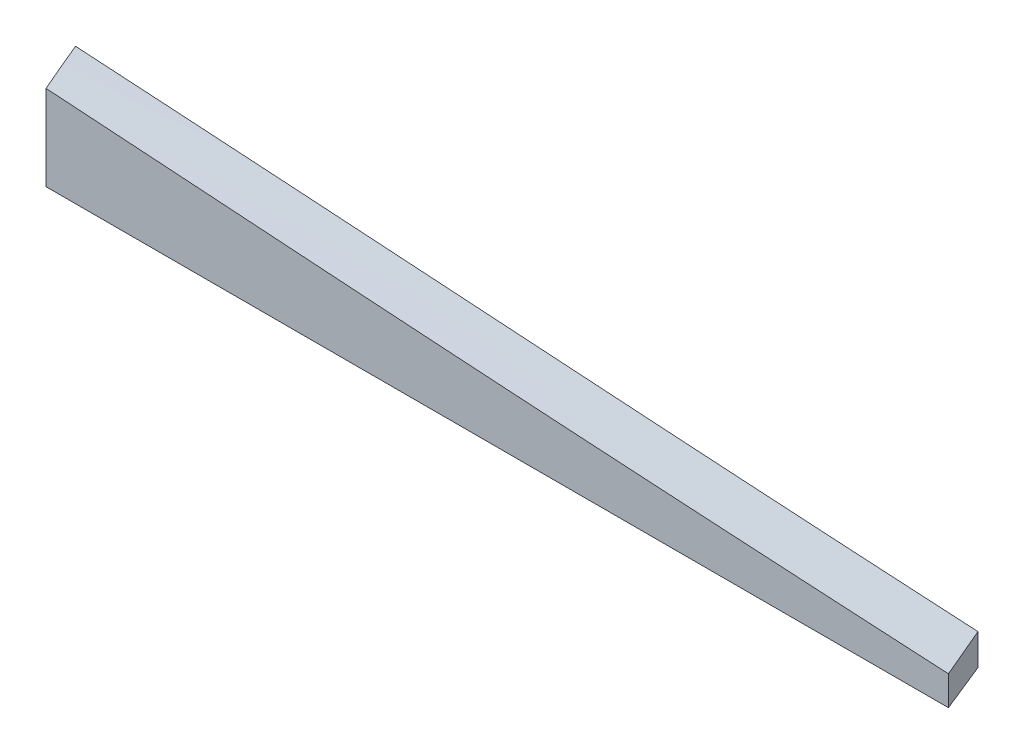
ISO-10303-21;
HEADER;
FILE_DESCRIPTION(('STEP AP214'),'2;1');
FILE_NAME('part.step','',(''),(''),'','','');
FILE_SCHEMA(('AUTOMOTIVE_DESIGN { 1 0 10303 214 1 1 1 1 }'));
ENDSEC;
DATA;
#1=APPLICATION_CONTEXT('core data for automotive mechanical design processes');
#2=APPLICATION_PROTOCOL_DEFINITION('international standard','automotive_design',2000,#1);
#3=PRODUCT_CONTEXT('',#1,'mechanical');
#4=PRODUCT('Part','Part','',(#3));
#5=PRODUCT_RELATED_PRODUCT_CATEGORY('part','',(#4));
#6=PRODUCT_DEFINITION_FORMATION('','',#4);
#7=PRODUCT_DEFINITION_CONTEXT('part definition',#1,'design');
#8=PRODUCT_DEFINITION('design','',#6,#7);
#9=PRODUCT_DEFINITION_SHAPE('','',#8);
#10=(LENGTH_UNIT() NAMED_UNIT(*) SI_UNIT(.MILLI.,.METRE.));
#11=(NAMED_UNIT(*) PLANE_ANGLE_UNIT() SI_UNIT($,.RADIAN.));
#12=(NAMED_UNIT(*) SI_UNIT($,.STERADIAN.) SOLID_ANGLE_UNIT());
#13=UNCERTAINTY_MEASURE_WITH_UNIT(LENGTH_MEASURE(1.E-05),#10,'distance_accuracy_value','');
#14=(GEOMETRIC_REPRESENTATION_CONTEXT(3) GLOBAL_UNCERTAINTY_ASSIGNED_CONTEXT((#13)) GLOBAL_UNIT_ASSIGNED_CONTEXT((#10,
#11,#12)) REPRESENTATION_CONTEXT('',''));
#15=CARTESIAN_POINT('',(0.,0.,0.));
#16=DIRECTION('',(0.,0.,1.));
#17=DIRECTION('',(1.,0.,0.));
#18=AXIS2_PLACEMENT_3D('',#15,#16,#17);
#19=CARTESIAN_POINT('',(176.191855416292,176.191855416292,10.1599999999991));
#20=DIRECTION('',(0.,0.,-1.));
#21=DIRECTION('',(1.,0.,0.));
#22=AXIS2_PLACEMENT_3D('',#19,#20,#21);
#23=PLANE('',#22);
#24=CARTESIAN_POINT('',(176.191855416292,6.02113642863957,10.1599999999991));
#25=CARTESIAN_POINT('',(174.247225110163,6.12565126559782,10.1599999999991));
#26=CARTESIAN_POINT('',(172.302627164037,6.23076641518892,10.1599999999991));
#27=CARTESIAN_POINT('',(168.413490923062,6.44209305818941,10.1599999999991));
#28=CARTESIAN_POINT('',(166.468952628209,6.54830455154917,10.1599999999991));
#29=CARTESIAN_POINT('',(160.635419421535,6.86842713566667,10.1599999999991));
#30=CARTESIAN_POINT('',(156.74650611934,7.08382633413848,10.1599999999991));
#31=CARTESIAN_POINT('',(148.968864720051,7.51825217315289,10.1599999999991));
#32=CARTESIAN_POINT('',(145.080136623869,7.73727882999431,10.1599999999991));
#33=CARTESIAN_POINT('',(137.302889918895,8.17902291198163,10.1599999999991));
#34=CARTESIAN_POINT('',(133.414371310106,8.40174033718502,10.1599999999991));
#35=CARTESIAN_POINT('',(125.637562775753,8.85112386805549,10.1599999999991));
#36=CARTESIAN_POINT('',(121.749272850155,9.07778997311207,10.1599999999991));
#37=CARTESIAN_POINT('',(113.972945937793,9.53542415465873,10.1599999999991));
#38=CARTESIAN_POINT('',(110.084908951034,9.76639223122176,10.1599999999991));
#39=CARTESIAN_POINT('',(102.309133793561,10.2331541702599,10.1599999999991));
#40=CARTESIAN_POINT('',(98.4213956221521,10.4689480211409,10.1599999999991));
#41=CARTESIAN_POINT('',(90.6462464559804,10.945864050744,10.1599999999991));
#42=CARTESIAN_POINT('',(86.7588354611758,11.1869862287767,10.1599999999991));
#43=CARTESIAN_POINT('',(79.0544469405619,11.6704084780646,10.1599999999991));
#44=CARTESIAN_POINT('',(75.2374631667408,11.9126089355652,10.1599999999991));
#45=CARTESIAN_POINT('',(67.6038423962115,12.4024142603291,10.1599999999991));
#46=CARTESIAN_POINT('',(63.7872053995356,12.6500191280943,10.1599999999991));
#47=CARTESIAN_POINT('',(56.1541688068635,13.1489858077573,10.1599999999991));
#48=CARTESIAN_POINT('',(52.3377692114371,13.4003476283461,10.1599999999991));
#49=CARTESIAN_POINT('',(44.7051021546362,13.9050677187285,10.1599999999991));
#50=CARTESIAN_POINT('',(40.8888346932661,14.1584259885886,10.1599999999991));
#51=CARTESIAN_POINT('',(33.256340948859,14.6659804763045,10.1599999999991));
#52=CARTESIAN_POINT('',(29.4401146660344,14.9201766973516,10.1599999999991));
#53=CARTESIAN_POINT('',(21.8076515239075,15.4284102488604,10.1599999999991));
#54=CARTESIAN_POINT('',(17.9914146646052,15.6824475793227,10.1599999999991));
#55=CARTESIAN_POINT('',(10.3588866024945,16.1894698818889,10.159999999999));
#56=CARTESIAN_POINT('',(6.54259539997121,16.4424548582829,10.159999999999));
#57=CARTESIAN_POINT('',(-1.0900850981135,16.9469495597178,10.1599999999991));
#58=CARTESIAN_POINT('',(-4.9064743936905,17.1984592845236,10.1599999999991));
#59=CARTESIAN_POINT('',(-8.72292621578063,17.4490193750531,10.1599999999991));
#60=B_SPLINE_CURVE_WITH_KNOTS('',3,(#24,#25,#26,#27,#28,#29,#30,#31,#32,#33,#34,#35,#36,#37,#38,
#39,#40,#41,#42,#43,#44,#45,#46,#47,#48,#49,#50,#51,#52,#53,#54,#55,#56,#57,#58,#59),
.UNSPECIFIED.,.F.,.F.,(4,2,2,2,2,2,2,2,2,2,2,2,2,2,2,2,2,4),(0.,5.84231037381248,
11.6846204830539,23.3692404964694,35.0539130252225,46.7385857359972,58.4232566402361,
70.1079277426063,81.792570775328,93.4772122964424,104.951189051152,116.425166871693,
127.8991712397,139.373175989974,150.847224488699,162.321272938515,173.795274566627,
185.269278024592),.UNSPECIFIED.);
#61=CARTESIAN_POINT('',(176.191855416292,6.02113642863957,10.1599999999991));
#62=VERTEX_POINT('',#61);
#63=CARTESIAN_POINT('',(-8.7229262157806,17.4490193750531,10.159999999999));
#64=VERTEX_POINT('',#63);
#65=EDGE_CURVE('E52',#62,#64,#60,.T.);
#66=ORIENTED_EDGE('',*,*,#65,.T.);
#67=DIRECTION('',(0.,-1.,0.));
#68=VECTOR('',#67,1.);
#69=CARTESIAN_POINT('',(-8.7229262157806,176.191855416292,10.159999999999));
#70=LINE('',#69,#68);
#71=CARTESIAN_POINT('',(-8.7229262157806,0.,10.159999999999));
#72=VERTEX_POINT('',#71);
#73=EDGE_CURVE('E108',#64,#72,#70,.T.);
#74=ORIENTED_EDGE('',*,*,#73,.T.);
#75=DIRECTION('',(-1.,0.,0.));
#76=VECTOR('',#75,1.);
#77=CARTESIAN_POINT('',(176.191855416292,0.,10.1599999999991));
#78=LINE('',#77,#76);
#79=CARTESIAN_POINT('',(176.191855416292,0.,10.1599999999991));
#80=VERTEX_POINT('',#79);
#81=EDGE_CURVE('E97',#80,#72,#78,.T.);
#82=ORIENTED_EDGE('',*,*,#81,.F.);
#83=DIRECTION('',(0.,-1.,0.));
#84=VECTOR('',#83,1.);
#85=CARTESIAN_POINT('',(176.191855416292,176.191855416292,10.1599999999991));
#86=LINE('',#85,#84);
#87=EDGE_CURVE('E103',#62,#80,#86,.T.);
#88=ORIENTED_EDGE('',*,*,#87,.F.);
#89=EDGE_LOOP('',(#66,#74,#82,#88));
#90=FACE_BOUND('',#89,.T.);
#91=ADVANCED_FACE('F38',(#90),#23,.F.);
#92=CARTESIAN_POINT('',(-12.8278326702659,176.191855416292,-9.29811783123569E-13));
#93=DIRECTION('',(0.927183854566784,0.,-0.374606593415919));
#94=DIRECTION('',(0.374606593415919,0.,0.927183854566784));
#95=AXIS2_PLACEMENT_3D('',#92,#93,#94);
#96=PLANE('',#95);
#97=CARTESIAN_POINT('',(-55.4579622929203,-12.2355937801033,-105.513273388463));
#98=CARTESIAN_POINT('',(-54.0571308052023,-8.60514732719372,-102.04609378936));
#99=CARTESIAN_POINT('',(-51.018481414229,-2.46786226068874,-94.5251726296211));
#100=CARTESIAN_POINT('',(-45.8041521424652,4.7671403013764,-81.6192547996951));
#101=CARTESIAN_POINT('',(-38.9234282314796,9.23952699906764,-64.5888655056279));
#102=CARTESIAN_POINT('',(-30.130098656912,14.0639848646942,-42.8246110778595));
#103=CARTESIAN_POINT('',(-18.8078079555961,18.3278371209846,-14.8009582124757));
#104=CARTESIAN_POINT('',(-9.36093531552927,17.7841951964629,8.58087206485128));
#105=CARTESIAN_POINT('',(2.5966920536482,15.2071354720518,38.1770383643526));
#106=CARTESIAN_POINT('',(12.2538419080826,14.0608222999372,62.0793230105337));
#107=CARTESIAN_POINT('',(30.8844858051604,7.32123956202062,108.19178479087));
#108=CARTESIAN_POINT('',(70.3636495182488,-3.48123407166321,205.906143881003));
#109=CARTESIAN_POINT('',(96.9055824868044,-11.6348174747198,271.59973323573));
#110=CARTESIAN_POINT('',(113.639406371967,-16.8338696421729,313.017400741277));
#111=B_SPLINE_CURVE_WITH_KNOTS('',3,(#97,#98,#99,#100,#101,#102,#103,#104,#105,#106,#107,#108,
#109,#110),.UNSPECIFIED.,.F.,.F.,(4,1,1,1,1,1,1,1,1,1,1,4),(0.,0.0394948802864952,
0.0758203782734546,0.117565574528788,0.181239187941656,0.256865620502935,0.346598051719973,
0.372016828557867,0.495604882179206,0.537891492765754,0.752596323836803,1.),.UNSPECIFIED.);
#112=CARTESIAN_POINT('',(-12.8278326702659,17.7840844442362,-9.29811783123569E-13));
#113=VERTEX_POINT('',#112);
#114=EDGE_CURVE('E92',#113,#64,#111,.T.);
#115=ORIENTED_EDGE('',*,*,#114,.F.);
#116=DIRECTION('',(0.,-1.,0.));
#117=VECTOR('',#116,1.);
#118=CARTESIAN_POINT('',(-12.8278326702659,176.191855416292,-9.29811783123569E-13));
#119=LINE('',#118,#117);
#120=CARTESIAN_POINT('',(-12.8278326702659,0.,-9.29811783123569E-13));
#121=VERTEX_POINT('',#120);
#122=EDGE_CURVE('E149',#113,#121,#119,.T.);
#123=ORIENTED_EDGE('',*,*,#122,.T.);
#124=DIRECTION('',(-0.374606593415919,0.,-0.927183854566784));
#125=VECTOR('',#124,1.);
#126=CARTESIAN_POINT('',(-12.8278326702659,0.,-9.29811783123569E-13));
#127=LINE('',#126,#125);
#128=EDGE_CURVE('E84',#72,#121,#127,.T.);
#129=ORIENTED_EDGE('',*,*,#128,.F.);
#130=ORIENTED_EDGE('',*,*,#73,.F.);
#131=EDGE_LOOP('',(#115,#123,#129,#130));
#132=FACE_BOUND('',#131,.T.);
#133=ADVANCED_FACE('F132',(#132),#96,.F.);
#134=CARTESIAN_POINT('',(-12.8278326702659,176.191855416292,-9.29811783123569E-13));
#135=DIRECTION('',(0.,0.,1.));
#136=DIRECTION('',(-1.,0.,0.));
#137=AXIS2_PLACEMENT_3D('',#134,#135,#136);
#138=PLANE('',#137);
#139=CARTESIAN_POINT('',(-12.8278326702659,17.7840844442362,-9.32576498663407E-13));
#140=CARTESIAN_POINT('',(-8.94008667324987,17.5484425688414,-9.326136906127E-13));
#141=CARTESIAN_POINT('',(-5.0524492825101,17.3110143878703,-9.30982343780425E-13));
#142=CARTESIAN_POINT('',(2.72262730106562,16.8329507960456,-9.28641222780606E-13));
#143=CARTESIAN_POINT('',(6.61006649395444,16.5923153860521,-9.27931448365936E-13));
#144=CARTESIAN_POINT('',(14.3847632272216,16.1082028742682,-9.31692115678267E-13));
#145=CARTESIAN_POINT('',(18.2720207678075,15.8647257758073,-9.36162551336311E-13));
#146=CARTESIAN_POINT('',(26.0463838668592,15.3753522126571,-9.23461014269975E-13));
#147=CARTESIAN_POINT('',(29.9334894253097,15.1294557477236,-9.06289039361679E-13));
#148=CARTESIAN_POINT('',(37.7075754223839,14.6357271711874,-9.06280152601976E-13));
#149=CARTESIAN_POINT('',(41.5945558610738,14.3878950606254,-9.23443222292992E-13));
#150=CARTESIAN_POINT('',(49.368428094785,13.8908540058521,-9.3618034306825E-13));
#151=CARTESIAN_POINT('',(53.2553198898186,13.6416450618324,-9.3175439715562E-13));
#152=CARTESIAN_POINT('',(61.029053347824,13.1424808848518,-9.27869170169666E-13));
#153=CARTESIAN_POINT('',(64.9158950108224,12.8925256523052,-9.28409886339849E-13));
#154=CARTESIAN_POINT('',(72.6895762353226,12.3925545900016,-9.31213680550283E-13));
#155=CARTESIAN_POINT('',(76.5764157968226,12.1425387602169,-9.33476759380514E-13));
#156=CARTESIAN_POINT('',(83.0077628743897,11.729617812575,-9.32076855037499E-13));
#157=CARTESIAN_POINT('',(85.5522534393229,11.5664488988833,-9.30190596175106E-13));
#158=CARTESIAN_POINT('',(90.6412843901417,11.240889120982,-9.29432970070498E-13));
#159=CARTESIAN_POINT('',(93.1858247760276,11.0784982567756,-9.30561602840489E-13));
#160=CARTESIAN_POINT('',(98.2749756238796,10.7548375133119,-9.2906196377843E-13));
#161=CARTESIAN_POINT('',(100.81958608581,10.593567633499,-9.26433693809161E-13));
#162=CARTESIAN_POINT('',(105.908902258608,10.2725364827876,-9.33189872432498E-13));
#163=CARTESIAN_POINT('',(108.453607969474,10.1127752118868,-9.42574321005624E-13));
#164=CARTESIAN_POINT('',(113.543141122039,9.79525190155789,-9.17049260827536E-13));
#165=CARTESIAN_POINT('',(116.087968563585,9.63748985968852,-8.82139806169517E-13));
#166=CARTESIAN_POINT('',(121.177771359067,9.32436982913132,-9.77483758381535E-13));
#167=CARTESIAN_POINT('',(123.722746712998,9.16901184035797,-1.10773715937536E-12));
#168=CARTESIAN_POINT('',(128.812877318565,8.8609364852298,-7.51885010915889E-13));
#169=CARTESIAN_POINT('',(131.358032571457,8.70821913960217,-2.6577462566373E-13));
#170=CARTESIAN_POINT('',(136.448493120379,8.40530672790866,-1.5938489632016E-12));
#171=CARTESIAN_POINT('',(138.993798416414,8.25511166192869,-3.40803376434347E-12));
#172=CARTESIAN_POINT('',(146.629941113596,7.80817312376439,4.02664473019398E-12));
#173=CARTESIAN_POINT('',(151.720992434284,7.51507709048612,2.61528153281085E-11));
#174=CARTESIAN_POINT('',(159.357946822975,7.08184279247276,-1.44712066458222E-11));
#175=CARTESIAN_POINT('',(161.903668830378,6.93849923106716,-4.03149486702122E-11));
#176=CARTESIAN_POINT('',(166.995225837265,6.65384161475252,3.84553175864964E-11));
#177=CARTESIAN_POINT('',(169.541060836728,6.5125275594561,1.43069300967034E-10));
#178=CARTESIAN_POINT('',(172.086948959668,6.37217453380223,3.90443320036349E-10));
#179=B_SPLINE_CURVE_WITH_KNOTS('',3,(#139,#140,#141,#142,#143,#144,#145,#146,#147,#148,#149,
#150,#151,#152,#153,#154,#155,#156,#157,#158,#159,#160,#161,#162,#163,#164,#165,#166,#167,#168,
#169,#170,#171,#172,#173,#174,#175,#176,#177,#178),.UNSPECIFIED.,.F.,.F.,(4,2,2,2,2,2,2,2,2,2,2,
2,2,2,2,2,2,2,2,4),(0.,11.6846413447341,23.3692795561543,35.0539040782631,46.7385297794579,
58.4231491993205,70.1077669938007,81.792378303329,93.4769949721338,101.126145641964,
108.775296342764,116.424443250895,124.073590146622,131.722727700964,139.371864983164,
147.02106227849,154.670259834361,169.968693685224,177.617956539398,185.267217933553),.UNSPECIFIED.);
#180=CARTESIAN_POINT('',(172.086948961806,6.37217453368596,-9.29811783123569E-13));
#181=VERTEX_POINT('',#180);
#182=EDGE_CURVE('E11',#113,#181,#179,.T.);
#183=ORIENTED_EDGE('',*,*,#182,.T.);
#184=DIRECTION('',(0.,-1.,0.));
#185=VECTOR('',#184,1.);
#186=CARTESIAN_POINT('',(172.086948961806,176.191855416292,-9.29811783123569E-13));
#187=LINE('',#186,#185);
#188=CARTESIAN_POINT('',(172.086948961806,0.,-9.29811783123569E-13));
#189=VERTEX_POINT('',#188);
#190=EDGE_CURVE('E101',#181,#189,#187,.T.);
#191=ORIENTED_EDGE('',*,*,#190,.T.);
#192=DIRECTION('',(1.,0.,0.));
#193=VECTOR('',#192,1.);
#194=CARTESIAN_POINT('',(-12.8278326702659,0.,-9.29811783123569E-13));
#195=LINE('',#194,#193);
#196=EDGE_CURVE('E99',#121,#189,#195,.T.);
#197=ORIENTED_EDGE('',*,*,#196,.F.);
#198=ORIENTED_EDGE('',*,*,#122,.F.);
#199=EDGE_LOOP('',(#183,#191,#197,#198));
#200=FACE_BOUND('',#199,.T.);
#201=ADVANCED_FACE('F135',(#200),#138,.F.);
#202=CARTESIAN_POINT('',(172.086948961806,176.191855416292,-9.29811783123569E-13));
#203=DIRECTION('',(-0.927183854566784,0.,0.374606593415921));
#204=DIRECTION('',(-0.374606593415921,0.,-0.927183854566784));
#205=AXIS2_PLACEMENT_3D('',#202,#203,#204);
#206=PLANE('',#205);
#207=CARTESIAN_POINT('',(156.781666499838,-1237.73312656953,-37.8819034094422));
#208=DIRECTION('',(0.927183854566784,0.,-0.37460659341592));
#209=DIRECTION('',(-0.37460659341592,0.,-0.927183854566784));
#210=AXIS2_PLACEMENT_3D('',#207,#208,#209);
#211=ELLIPSE('',#210,1342.43267001044,1244.68189747666);
#212=EDGE_CURVE('E60',#181,#62,#211,.T.);
#213=ORIENTED_EDGE('',*,*,#212,.T.);
#214=ORIENTED_EDGE('',*,*,#87,.T.);
#215=DIRECTION('',(0.374606593415921,0.,0.927183854566784));
#216=VECTOR('',#215,1.);
#217=CARTESIAN_POINT('',(172.086948961806,0.,-9.29811783123569E-13));
#218=LINE('',#217,#216);
#219=EDGE_CURVE('E67',#189,#80,#218,.T.);
#220=ORIENTED_EDGE('',*,*,#219,.F.);
#221=ORIENTED_EDGE('',*,*,#190,.F.);
#222=EDGE_LOOP('',(#213,#214,#220,#221));
#223=FACE_BOUND('',#222,.T.);
#224=ADVANCED_FACE('F104',(#223),#206,.F.);
#225=CARTESIAN_POINT('',(0.,0.,0.));
#226=DIRECTION('',(0.,-1.,0.));
#227=DIRECTION('',(0.,0.,1.));
#228=AXIS2_PLACEMENT_3D('',#225,#226,#227);
#229=PLANE('',#228);
#230=ORIENTED_EDGE('',*,*,#81,.T.);
#231=ORIENTED_EDGE('',*,*,#128,.T.);
#232=ORIENTED_EDGE('',*,*,#196,.T.);
#233=ORIENTED_EDGE('',*,*,#219,.T.);
#234=EDGE_LOOP('',(#230,#231,#232,#233));
#235=FACE_BOUND('',#234,.T.);
#236=ADVANCED_FACE('F95',(#235),#229,.T.);
#237=CARTESIAN_POINT('',(113.639406371967,-16.8338696421729,313.017400741277));
#238=CARTESIAN_POINT('',(244.734031016362,-12.2355939291147,179.807837732279));
#239=CARTESIAN_POINT('',(110.795301709561,-15.9502312932207,305.977994681618));
#240=CARTESIAN_POINT('',(242.852280122993,-11.4082652181231,175.150340834698));
#241=CARTESIAN_POINT('',(105.096607861796,-14.1825006641445,291.873232457371));
#242=CARTESIAN_POINT('',(239.092679703024,-9.80996008523209,165.845003261134));
#243=CARTESIAN_POINT('',(96.5205219378677,-11.5423269838951,270.646674933287));
#244=CARTESIAN_POINT('',(233.462665592149,-7.57920233262644,151.91022935076));
#245=CARTESIAN_POINT('',(87.9199023629524,-8.92754099339635,249.35939449218));
#246=CARTESIAN_POINT('',(227.839720419128,-5.51278760620601,137.992951675536));
#247=CARTESIAN_POINT('',(80.7353690440714,-6.77993153840777,231.577050526687));
#248=CARTESIAN_POINT('',(223.157892238802,-3.92576375555529,126.405020296457));
#249=CARTESIAN_POINT('',(74.9793414975401,-5.08458683372944,217.330382418365));
#250=CARTESIAN_POINT('',(219.413646582244,-2.73595926758169,117.137687095948));
#251=CARTESIAN_POINT('',(70.6586550114969,-3.82488728155377,206.636308099027));
#252=CARTESIAN_POINT('',(216.605795792335,-1.88339107047639,110.188012519491));
#253=CARTESIAN_POINT('',(66.3348513195977,-2.57712188799772,195.934518424454));
#254=CARTESIAN_POINT('',(213.798003463596,-1.07048591484743,103.238482639507));
#255=CARTESIAN_POINT('',(62.0084771173262,-1.34159901206772,185.226366513453));
#256=CARTESIAN_POINT('',(210.989994604686,-0.297121673296249,96.2884168285422));
#257=CARTESIAN_POINT('',(57.6803144087103,-0.11274928052497,174.513787893911));
#258=CARTESIAN_POINT('',(208.181494224264,0.436823781575724,89.3371344591452));
#259=CARTESIAN_POINT('',(53.3511435517817,1.11500910210803,163.798714019735));
#260=CARTESIAN_POINT('',(205.372227330989,1.13147257716707,82.3839549038634));
#261=CARTESIAN_POINT('',(49.0217168456074,2.3465457832221,153.083006896454));
#262=CARTESIAN_POINT('',(202.561918933521,1.78694684087636,75.4281975352444));
#263=CARTESIAN_POINT('',(44.6928013054113,3.58703277621047,142.368564953365));
#264=CARTESIAN_POINT('',(199.750294040518,2.40336870010216,68.4691817258357));
#265=CARTESIAN_POINT('',(41.0864535806168,4.63287089018253,133.442541110878));
#266=CARTESIAN_POINT('',(197.405947057287,2.88461168521956,62.6667193277935));
#267=CARTESIAN_POINT('',(38.2024491395303,5.48023732544504,126.304379633551));
#268=CARTESIAN_POINT('',(195.529532058091,3.25012877705471,58.0224292317307));
#269=CARTESIAN_POINT('',(36.0400971107402,6.12213829728261,120.952370554635));
#270=CARTESIAN_POINT('',(194.121716685096,3.51452490837263,54.5379639099921));
#271=CARTESIAN_POINT('',(33.878520825947,6.77164999324718,115.602281509487));
#272=CARTESIAN_POINT('',(192.713361771208,3.76917631270302,51.052163177685));
#273=CARTESIAN_POINT('',(31.7178485070863,7.43007092686474,110.254429858535));
#274=CARTESIAN_POINT('',(191.304431899135,4.01407995061681,47.5649393739323));
#275=CARTESIAN_POINT('',(29.5582401527884,8.09934698826074,104.909211612284));
#276=CARTESIAN_POINT('',(189.894891651584,4.24923278268492,44.0762048378571));
#277=CARTESIAN_POINT('',(27.3998444376294,8.78113491398389,99.5669947532239));
#278=CARTESIAN_POINT('',(188.484705611261,4.47463176947829,40.5858719085824));
#279=CARTESIAN_POINT('',(25.2429069653014,9.47905710659962,94.2283871718241));
#280=CARTESIAN_POINT('',(187.073838360873,4.69027387156783,37.093852925231));
#281=CARTESIAN_POINT('',(23.087592535403,10.1948686275091,88.8937967614042));
#282=CARTESIAN_POINT('',(185.662254483126,4.89615604952447,33.6000602269262));
#283=CARTESIAN_POINT('',(20.9344424098818,10.9379382283173,83.5645631922952));
#284=CARTESIAN_POINT('',(184.249918560728,5.09227526391914,30.1044061527907));
#285=CARTESIAN_POINT('',(18.7822903868581,11.6818912571797,78.2378000135562));
#286=CARTESIAN_POINT('',(182.836795176385,5.27862847532277,26.6068030419477));
#287=CARTESIAN_POINT('',(16.6291758215043,12.3852525933449,72.9086544589498));
#288=CARTESIAN_POINT('',(181.422848912803,5.45521264430627,23.1071632335201));
#289=CARTESIAN_POINT('',(14.4733022842286,12.999796409826,67.5726802092109));
#290=CARTESIAN_POINT('',(180.00804435269,5.62202473144058,19.605399066631));
#291=CARTESIAN_POINT('',(12.3155602674344,13.5331243649529,62.2320813103797));
#292=CARTESIAN_POINT('',(178.592346078752,5.77906169729662,16.1014228804032));
#293=CARTESIAN_POINT('',(10.157021450024,14.0046036674132,56.8895102608187));
#294=CARTESIAN_POINT('',(177.175718673696,5.92632050244531,12.5951470139598));
#295=CARTESIAN_POINT('',(7.99837217427009,14.4283592517912,51.5466658172636));
#296=CARTESIAN_POINT('',(175.758126720229,6.06379810745759,9.08648380642378));
#297=CARTESIAN_POINT('',(5.84023606774644,14.8207557505574,46.2050915121241));
#298=CARTESIAN_POINT('',(174.339530481478,6.19147055645664,5.5753349055867));
#299=CARTESIAN_POINT('',(3.68307926214773,15.1962510000121,40.8659410618293));
#300=CARTESIAN_POINT('',(172.919890220573,6.30931389356568,2.06160195924007));
#301=CARTESIAN_POINT('',(1.52736012197856,15.5705412481707,35.5303489583389));
#302=CARTESIAN_POINT('',(171.499166200642,6.41730416290789,-1.45481338482463));
#303=CARTESIAN_POINT('',(-0.626529722143061,15.9572292268477,30.1992845214467));
#304=CARTESIAN_POINT('',(170.077318684813,6.51541740860648,-4.97400947881586));
#305=CARTESIAN_POINT('',(-2.77804144271454,16.3739991983539,24.8741061468893));
#306=CARTESIAN_POINT('',(168.654307936214,6.60362967478464,-8.4960846749421));
#307=CARTESIAN_POINT('',(-4.92695075269682,16.8242706710665,19.5553689645684));
#308=CARTESIAN_POINT('',(167.230094217974,6.68191700556558,-12.0211373254118));
#309=CARTESIAN_POINT('',(-7.07560334164495,17.2226378645503,14.2372671891041));
#310=CARTESIAN_POINT('',(165.804637793222,6.75025544507248,-15.5492657824335));
#311=CARTESIAN_POINT('',(-9.22467108892213,17.5282660272678,8.91813786071754));
#312=CARTESIAN_POINT('',(164.377898925086,6.80862103742856,-19.0805683982156));
#313=CARTESIAN_POINT('',(-12.0898744330643,17.7990674548654,1.82651073126705));
#314=CARTESIAN_POINT('',(162.47381752723,6.87311275653316,-23.7933352338837));
#315=CARTESIAN_POINT('',(-15.6695495433813,17.8513526959539,-7.03349607377988));
#316=CARTESIAN_POINT('',(160.090310987091,6.92867550815282,-29.6927209364123));
#317=CARTESIAN_POINT('',(-19.9535850198917,17.3459501914322,-17.6368559612595));
#318=CARTESIAN_POINT('',(157.224337575443,6.95507612746427,-36.7862540498242));
#319=CARTESIAN_POINT('',(-22.7922515197864,16.5844611671309,-24.6628020963821));
#320=CARTESIAN_POINT('',(155.309632995374,6.94569898724086,-41.5253141841289));
#321=CARTESIAN_POINT('',(-26.1351459531658,15.495920563644,-32.9367561607978));
#322=CARTESIAN_POINT('',(153.043819055656,6.91859463696332,-47.1334004786109));
#323=CARTESIAN_POINT('',(-29.8080111488932,14.0000270674217,-42.0274165211127));
#324=CARTESIAN_POINT('',(150.340110376731,6.65919371585901,-53.8253142852857));
#325=CARTESIAN_POINT('',(-35.0373098473586,11.381252937306,-54.970384982271));
#326=CARTESIAN_POINT('',(146.098399949932,5.4632358347837,-64.3239159986531));
#327=CARTESIAN_POINT('',(-40.1407072358436,8.43132589110993,-67.6017367662689));
#328=CARTESIAN_POINT('',(141.80440998763,3.40596243150295,-74.9519141030488));
#329=CARTESIAN_POINT('',(-43.5624995109682,6.21625294056355,-76.0709698415509));
#330=CARTESIAN_POINT('',(139.013961203779,1.49672773225887,-81.8585172030911));
#331=CARTESIAN_POINT('',(-45.7281681653784,4.18884813751625,-81.4311878569373));
#332=CARTESIAN_POINT('',(137.277829452183,0.132816177567587,-86.1555940772638));
#333=CARTESIAN_POINT('',(-46.6603509624804,3.23210036336016,-83.7384212430253));
#334=CARTESIAN_POINT('',(136.511806213547,-0.533721522561266,-88.051568124623));
#335=CARTESIAN_POINT('',(-48.4540544790494,1.05192782094865,-88.1779932358117));
#336=CARTESIAN_POINT('',(134.990232122227,-2.12900890756051,-91.8175961545488));
#337=CARTESIAN_POINT('',(-50.5889483585071,-2.11965028540224,-93.4620410102961));
#338=CARTESIAN_POINT('',(133.144700679698,-4.60732592780839,-96.3854467655184));
#339=CARTESIAN_POINT('',(-53.0618198171815,-6.58766915193146,-99.5826126478495));
#340=CARTESIAN_POINT('',(131.136185731308,-8.20552944955988,-101.356695709168));
#341=CARTESIAN_POINT('',(-54.6677511617253,-10.187653522157,-103.557432206219));
#342=CARTESIAN_POINT('',(129.983357555321,-10.8715652181279,-104.210045571801));
#343=CARTESIAN_POINT('',(-55.4579622929203,-12.2355937801033,-105.513273388463));
#344=CARTESIAN_POINT('',(129.457038163675,-12.2355939291147,-105.512731778764));
#345=B_SPLINE_SURFACE_WITH_KNOTS('',3,1,((#237,#238),(#239,#240),(#241,#242),(#243,#244),(#245,
#246),(#247,#248),(#249,#250),(#251,#252),(#253,#254),(#255,#256),(#257,#258),(#259,#260),(#261,
#262),(#263,#264),(#265,#266),(#267,#268),(#269,#270),(#271,#272),(#273,#274),(#275,#276),(#277,
#278),(#279,#280),(#281,#282),(#283,#284),(#285,#286),(#287,#288),(#289,#290),(#291,#292),(#293,
#294),(#295,#296),(#297,#298),(#299,#300),(#301,#302),(#303,#304),(#305,#306),(#307,#308),(#309,
#310),(#311,#312),(#313,#314),(#315,#316),(#317,#318),(#319,#320),(#321,#322),(#323,#324),(#325,
#326),(#327,#328),(#329,#330),(#331,#332),(#333,#334),(#335,#336),(#337,#338),(#339,#340),(#341,
#342),(#343,#344)),.UNSPECIFIED.,.F.,.F.,.F.,(4,1,1,1,1,1,1,1,1,1,1,1,1,1,1,1,1,1,1,1,1,1,1,1,1,
1,1,1,1,1,1,1,1,1,1,1,1,1,1,1,2,1,1,1,2,1,1,1,1,4),(2,2),(0.,0.0493417510349712,
0.0986835020699424,0.148025253104914,0.197367004139885,0.22203787965737,0.246708755174856,
0.271379630692342,0.296050506209827,0.320721381727313,0.345392257244798,0.370063132762284,
0.39473400827977,0.419404883797255,0.431740321555998,0.444075759314741,0.456411197073483,
0.468746634832226,0.481082072590969,0.493417510349712,0.505752948108455,0.518088385867198,
0.53042382362594,0.542759261384683,0.555094699143426,0.567430136902169,0.579765574660911,
0.592101012419654,0.604436450178397,0.61677188793714,0.629107325695883,0.641442763454626,
0.653778201213368,0.666113638972111,0.678449076730854,0.690784514489597,0.70311995224834,
0.715455390007082,0.740126265524568,0.764797141042053,0.789468016559539,0.823121947855717,
0.856775879151895,0.890429810448073,0.924083741744251,0.93357327402622,0.943062806308189,
0.962041870872126,0.981020935436063,1.),(0.,1.),.UNSPECIFIED.);
#346=ORIENTED_EDGE('',*,*,#212,.F.);
#347=ORIENTED_EDGE('',*,*,#182,.F.);
#348=ORIENTED_EDGE('',*,*,#114,.T.);
#349=ORIENTED_EDGE('',*,*,#65,.F.);
#350=EDGE_LOOP('',(#346,#347,#348,#349));
#351=FACE_BOUND('',#350,.T.);
#352=ADVANCED_FACE('F40',(#351),#345,.F.);
#353=CLOSED_SHELL('',(#91,#133,#201,#224,#236,#352));
#354=MANIFOLD_SOLID_BREP('B2',#353);
#355=ADVANCED_BREP_SHAPE_REPRESENTATION('',(#18,#354),#14);
#356=SHAPE_DEFINITION_REPRESENTATION(#9,#355);
ENDSEC;
END-ISO-10303-21;
